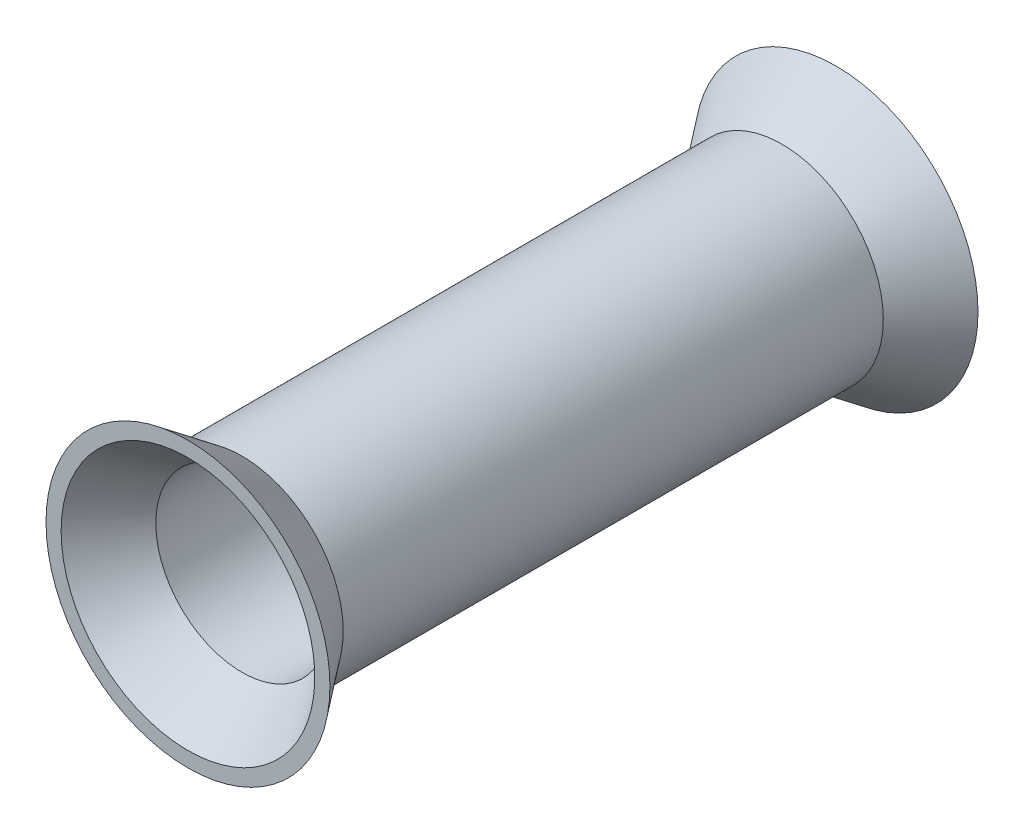
ISO-10303-21;
HEADER;
FILE_DESCRIPTION(('STEP AP214'),'2;1');
FILE_NAME('part.step','',(''),(''),'','','');
FILE_SCHEMA(('AUTOMOTIVE_DESIGN { 1 0 10303 214 1 1 1 1 }'));
ENDSEC;
DATA;
#1=APPLICATION_CONTEXT('core data for automotive mechanical design processes');
#2=APPLICATION_PROTOCOL_DEFINITION('international standard','automotive_design',2000,#1);
#3=PRODUCT_CONTEXT('',#1,'mechanical');
#4=PRODUCT('Part','Part','',(#3));
#5=PRODUCT_RELATED_PRODUCT_CATEGORY('part','',(#4));
#6=PRODUCT_DEFINITION_FORMATION('','',#4);
#7=PRODUCT_DEFINITION_CONTEXT('part definition',#1,'design');
#8=PRODUCT_DEFINITION('design','',#6,#7);
#9=PRODUCT_DEFINITION_SHAPE('','',#8);
#10=(LENGTH_UNIT() NAMED_UNIT(*) SI_UNIT(.MILLI.,.METRE.));
#11=(NAMED_UNIT(*) PLANE_ANGLE_UNIT() SI_UNIT($,.RADIAN.));
#12=(NAMED_UNIT(*) SI_UNIT($,.STERADIAN.) SOLID_ANGLE_UNIT());
#13=UNCERTAINTY_MEASURE_WITH_UNIT(LENGTH_MEASURE(1.E-05),#10,'distance_accuracy_value','');
#14=(GEOMETRIC_REPRESENTATION_CONTEXT(3) GLOBAL_UNCERTAINTY_ASSIGNED_CONTEXT((#13)) GLOBAL_UNIT_ASSIGNED_CONTEXT((#10,
#11,#12)) REPRESENTATION_CONTEXT('',''));
#15=CARTESIAN_POINT('',(0.,0.,0.));
#16=DIRECTION('',(0.,0.,1.));
#17=DIRECTION('',(1.,0.,0.));
#18=AXIS2_PLACEMENT_3D('',#15,#16,#17);
#19=CARTESIAN_POINT('',(0.,0.,12.7));
#20=DIRECTION('',(0.,0.,-1.));
#21=DIRECTION('',(-1.,0.,0.));
#22=AXIS2_PLACEMENT_3D('',#19,#20,#21);
#23=CYLINDRICAL_SURFACE('',#22,4.7625);
#24=CARTESIAN_POINT('',(0.,0.,12.7));
#25=DIRECTION('',(0.,0.,1.));
#26=DIRECTION('',(1.,0.,0.));
#27=AXIS2_PLACEMENT_3D('',#24,#25,#26);
#28=CIRCLE('',#27,4.7625);
#29=CARTESIAN_POINT('',(4.7625,0.,12.7));
#30=VERTEX_POINT('',#29);
#31=EDGE_CURVE('E10',#30,#30,#28,.T.);
#32=ORIENTED_EDGE('',*,*,#31,.F.);
#33=EDGE_LOOP('',(#32));
#34=FACE_BOUND('',#33,.T.);
#35=CARTESIAN_POINT('',(0.,0.,-12.7));
#36=DIRECTION('',(0.,0.,-1.));
#37=DIRECTION('',(-1.,0.,0.));
#38=AXIS2_PLACEMENT_3D('',#35,#36,#37);
#39=CIRCLE('',#38,4.7625);
#40=CARTESIAN_POINT('',(-4.7625,0.,-12.7));
#41=VERTEX_POINT('',#40);
#42=EDGE_CURVE('E42',#41,#41,#39,.T.);
#43=ORIENTED_EDGE('',*,*,#42,.F.);
#44=EDGE_LOOP('',(#43));
#45=FACE_BOUND('',#44,.T.);
#46=ADVANCED_FACE('F32',(#34,#45),#23,.T.);
#47=CARTESIAN_POINT('',(0.,0.,12.7));
#48=DIRECTION('',(0.,0.,-1.));
#49=DIRECTION('',(-1.,0.,0.));
#50=AXIS2_PLACEMENT_3D('',#47,#48,#49);
#51=CYLINDRICAL_SURFACE('',#50,4.0513);
#52=CARTESIAN_POINT('',(0.,0.,12.7));
#53=DIRECTION('',(0.,0.,1.));
#54=DIRECTION('',(1.,0.,0.));
#55=AXIS2_PLACEMENT_3D('',#52,#53,#54);
#56=CIRCLE('',#55,4.0513);
#57=CARTESIAN_POINT('',(4.0513,0.,12.7));
#58=VERTEX_POINT('',#57);
#59=EDGE_CURVE('E57',#58,#58,#56,.F.);
#60=ORIENTED_EDGE('',*,*,#59,.F.);
#61=EDGE_LOOP('',(#60));
#62=FACE_BOUND('',#61,.T.);
#63=CARTESIAN_POINT('',(0.,0.,-12.7));
#64=DIRECTION('',(0.,0.,-1.));
#65=DIRECTION('',(-1.,0.,0.));
#66=AXIS2_PLACEMENT_3D('',#63,#64,#65);
#67=CIRCLE('',#66,4.0513);
#68=CARTESIAN_POINT('',(-4.0513,0.,-12.7));
#69=VERTEX_POINT('',#68);
#70=EDGE_CURVE('E46',#69,#69,#67,.T.);
#71=ORIENTED_EDGE('',*,*,#70,.T.);
#72=EDGE_LOOP('',(#71));
#73=FACE_BOUND('',#72,.T.);
#74=ADVANCED_FACE('F73',(#62,#73),#51,.F.);
#75=CARTESIAN_POINT('',(0.,0.,-12.7));
#76=DIRECTION('',(0.,0.,-1.));
#77=DIRECTION('',(-1.,0.,0.));
#78=AXIS2_PLACEMENT_3D('',#75,#76,#77);
#79=CONICAL_SURFACE('',#78,4.7625,0.645771823237903);
#80=CARTESIAN_POINT('',(0.,0.,-15.24));
#81=DIRECTION('',(0.,0.,-1.));
#82=DIRECTION('',(-1.,0.,0.));
#83=AXIS2_PLACEMENT_3D('',#80,#81,#82);
#84=CIRCLE('',#83,6.6765272872611);
#85=CARTESIAN_POINT('',(-6.6765272872611,0.,-15.24));
#86=VERTEX_POINT('',#85);
#87=EDGE_CURVE('E38',#86,#86,#84,.T.);
#88=ORIENTED_EDGE('',*,*,#87,.F.);
#89=EDGE_LOOP('',(#88));
#90=FACE_BOUND('',#89,.T.);
#91=ORIENTED_EDGE('',*,*,#42,.T.);
#92=EDGE_LOOP('',(#91));
#93=FACE_BOUND('',#92,.T.);
#94=ADVANCED_FACE('F76',(#90,#93),#79,.T.);
#95=CARTESIAN_POINT('',(0.,0.,-15.24));
#96=DIRECTION('',(0.,0.,-1.));
#97=DIRECTION('',(-1.,0.,0.));
#98=AXIS2_PLACEMENT_3D('',#95,#96,#97);
#99=PLANE('',#98);
#100=CARTESIAN_POINT('',(0.,0.,-15.24));
#101=DIRECTION('',(0.,0.,-1.));
#102=DIRECTION('',(-1.,0.,0.));
#103=AXIS2_PLACEMENT_3D('',#100,#101,#102);
#104=CIRCLE('',#103,5.9653272872611);
#105=CARTESIAN_POINT('',(-5.9653272872611,0.,-15.24));
#106=VERTEX_POINT('',#105);
#107=EDGE_CURVE('E51',#106,#106,#104,.T.);
#108=ORIENTED_EDGE('',*,*,#107,.F.);
#109=EDGE_LOOP('',(#108));
#110=FACE_BOUND('',#109,.T.);
#111=ORIENTED_EDGE('',*,*,#87,.T.);
#112=EDGE_LOOP('',(#111));
#113=FACE_BOUND('',#112,.T.);
#114=ADVANCED_FACE('F82',(#110,#113),#99,.T.);
#115=CARTESIAN_POINT('',(0.,0.,-15.24));
#116=DIRECTION('',(0.,0.,-1.));
#117=DIRECTION('',(-1.,0.,0.));
#118=AXIS2_PLACEMENT_3D('',#115,#116,#117);
#119=CONICAL_SURFACE('',#118,5.9653272872611,0.645771823237903);
#120=ORIENTED_EDGE('',*,*,#107,.T.);
#121=EDGE_LOOP('',(#120));
#122=FACE_BOUND('',#121,.T.);
#123=ORIENTED_EDGE('',*,*,#70,.F.);
#124=EDGE_LOOP('',(#123));
#125=FACE_BOUND('',#124,.T.);
#126=ADVANCED_FACE('F79',(#122,#125),#119,.F.);
#127=CARTESIAN_POINT('',(0.,0.,12.7));
#128=DIRECTION('',(0.,0.,1.));
#129=DIRECTION('',(-1.,0.,0.));
#130=AXIS2_PLACEMENT_3D('',#127,#128,#129);
#131=CONICAL_SURFACE('',#130,4.7625,0.645771823237903);
#132=CARTESIAN_POINT('',(0.,0.,15.24));
#133=DIRECTION('',(0.,0.,1.));
#134=DIRECTION('',(1.,0.,0.));
#135=AXIS2_PLACEMENT_3D('',#132,#133,#134);
#136=CIRCLE('',#135,6.6765272872611);
#137=CARTESIAN_POINT('',(6.6765272872611,0.,15.24));
#138=VERTEX_POINT('',#137);
#139=EDGE_CURVE('E54',#138,#138,#136,.F.);
#140=ORIENTED_EDGE('',*,*,#139,.T.);
#141=EDGE_LOOP('',(#140));
#142=FACE_BOUND('',#141,.T.);
#143=ORIENTED_EDGE('',*,*,#31,.T.);
#144=EDGE_LOOP('',(#143));
#145=FACE_BOUND('',#144,.T.);
#146=ADVANCED_FACE('F81',(#142,#145),#131,.T.);
#147=CARTESIAN_POINT('',(0.,0.,15.24));
#148=DIRECTION('',(0.,0.,1.));
#149=DIRECTION('',(-1.,0.,0.));
#150=AXIS2_PLACEMENT_3D('',#147,#148,#149);
#151=PLANE('',#150);
#152=CARTESIAN_POINT('',(0.,0.,15.24));
#153=DIRECTION('',(0.,0.,-1.));
#154=DIRECTION('',(-1.,0.,0.));
#155=AXIS2_PLACEMENT_3D('',#152,#153,#154);
#156=CIRCLE('',#155,5.9653272872611);
#157=CARTESIAN_POINT('',(-5.9653272872611,0.,15.24));
#158=VERTEX_POINT('',#157);
#159=EDGE_CURVE('E60',#158,#158,#156,.T.);
#160=ORIENTED_EDGE('',*,*,#159,.T.);
#161=EDGE_LOOP('',(#160));
#162=FACE_BOUND('',#161,.T.);
#163=ORIENTED_EDGE('',*,*,#139,.F.);
#164=EDGE_LOOP('',(#163));
#165=FACE_BOUND('',#164,.T.);
#166=ADVANCED_FACE('F64',(#162,#165),#151,.T.);
#167=CARTESIAN_POINT('',(0.,0.,15.24));
#168=DIRECTION('',(0.,0.,1.));
#169=DIRECTION('',(-1.,0.,0.));
#170=AXIS2_PLACEMENT_3D('',#167,#168,#169);
#171=CONICAL_SURFACE('',#170,5.9653272872611,0.645771823237903);
#172=ORIENTED_EDGE('',*,*,#159,.F.);
#173=EDGE_LOOP('',(#172));
#174=FACE_BOUND('',#173,.T.);
#175=ORIENTED_EDGE('',*,*,#59,.T.);
#176=EDGE_LOOP('',(#175));
#177=FACE_BOUND('',#176,.T.);
#178=ADVANCED_FACE('F67',(#174,#177),#171,.F.);
#179=CLOSED_SHELL('',(#46,#74,#94,#114,#126,#146,#166,#178));
#180=MANIFOLD_SOLID_BREP('B2',#179);
#181=ADVANCED_BREP_SHAPE_REPRESENTATION('',(#18,#180),#14);
#182=SHAPE_DEFINITION_REPRESENTATION(#9,#181);
ENDSEC;
END-ISO-10303-21;
